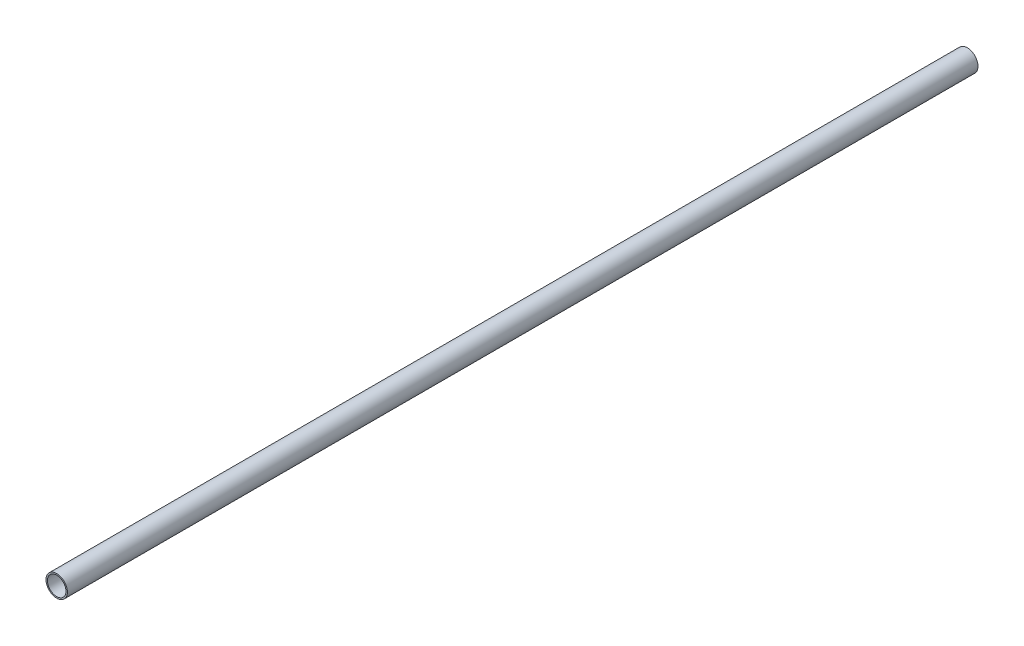
ISO-10303-21;
HEADER;
FILE_DESCRIPTION(('STEP AP214'),'2;1');
FILE_NAME('part.step','',(''),(''),'','','');
FILE_SCHEMA(('AUTOMOTIVE_DESIGN { 1 0 10303 214 1 1 1 1 }'));
ENDSEC;
DATA;
#1=APPLICATION_CONTEXT('core data for automotive mechanical design processes');
#2=APPLICATION_PROTOCOL_DEFINITION('international standard','automotive_design',2000,#1);
#3=PRODUCT_CONTEXT('',#1,'mechanical');
#4=PRODUCT('Part','Part','',(#3));
#5=PRODUCT_RELATED_PRODUCT_CATEGORY('part','',(#4));
#6=PRODUCT_DEFINITION_FORMATION('','',#4);
#7=PRODUCT_DEFINITION_CONTEXT('part definition',#1,'design');
#8=PRODUCT_DEFINITION('design','',#6,#7);
#9=PRODUCT_DEFINITION_SHAPE('','',#8);
#10=(LENGTH_UNIT() NAMED_UNIT(*) SI_UNIT(.MILLI.,.METRE.));
#11=(NAMED_UNIT(*) PLANE_ANGLE_UNIT() SI_UNIT($,.RADIAN.));
#12=(NAMED_UNIT(*) SI_UNIT($,.STERADIAN.) SOLID_ANGLE_UNIT());
#13=UNCERTAINTY_MEASURE_WITH_UNIT(LENGTH_MEASURE(1.E-05),#10,'distance_accuracy_value','');
#14=(GEOMETRIC_REPRESENTATION_CONTEXT(3) GLOBAL_UNCERTAINTY_ASSIGNED_CONTEXT((#13)) GLOBAL_UNIT_ASSIGNED_CONTEXT((#10,
#11,#12)) REPRESENTATION_CONTEXT('',''));
#15=CARTESIAN_POINT('',(0.,0.,0.));
#16=DIRECTION('',(0.,0.,1.));
#17=DIRECTION('',(1.,0.,0.));
#18=AXIS2_PLACEMENT_3D('',#15,#16,#17);
#19=CARTESIAN_POINT('',(0.,0.,-1016.));
#20=DIRECTION('',(0.,0.,1.));
#21=DIRECTION('',(1.,0.,0.));
#22=AXIS2_PLACEMENT_3D('',#19,#20,#21);
#23=CYLINDRICAL_SURFACE('',#22,11.938);
#24=CARTESIAN_POINT('',(0.,0.,-1016.));
#25=DIRECTION('',(0.,0.,1.));
#26=DIRECTION('',(1.,0.,0.));
#27=AXIS2_PLACEMENT_3D('',#24,#25,#26);
#28=CIRCLE('',#27,11.938);
#29=CARTESIAN_POINT('',(11.938,0.,-1016.));
#30=VERTEX_POINT('',#29);
#31=EDGE_CURVE('E10',#30,#30,#28,.T.);
#32=ORIENTED_EDGE('',*,*,#31,.T.);
#33=EDGE_LOOP('',(#32));
#34=FACE_BOUND('',#33,.T.);
#35=CARTESIAN_POINT('',(0.,0.,0.));
#36=DIRECTION('',(0.,0.,1.));
#37=DIRECTION('',(1.,0.,0.));
#38=AXIS2_PLACEMENT_3D('',#35,#36,#37);
#39=CIRCLE('',#38,11.938);
#40=CARTESIAN_POINT('',(11.938,0.,0.));
#41=VERTEX_POINT('',#40);
#42=EDGE_CURVE('E34',#41,#41,#39,.T.);
#43=ORIENTED_EDGE('',*,*,#42,.F.);
#44=EDGE_LOOP('',(#43));
#45=FACE_BOUND('',#44,.T.);
#46=ADVANCED_FACE('F31',(#34,#45),#23,.T.);
#47=CARTESIAN_POINT('',(0.,0.,-1016.));
#48=DIRECTION('',(0.,0.,1.));
#49=DIRECTION('',(1.,0.,0.));
#50=AXIS2_PLACEMENT_3D('',#47,#48,#49);
#51=PLANE('',#50);
#52=CARTESIAN_POINT('',(0.,0.,-1016.));
#53=DIRECTION('',(0.,0.,1.));
#54=DIRECTION('',(1.,0.,0.));
#55=AXIS2_PLACEMENT_3D('',#52,#53,#54);
#56=CIRCLE('',#55,10.3505);
#57=CARTESIAN_POINT('',(10.3505,0.,-1016.));
#58=VERTEX_POINT('',#57);
#59=EDGE_CURVE('E41',#58,#58,#56,.T.);
#60=ORIENTED_EDGE('',*,*,#59,.T.);
#61=EDGE_LOOP('',(#60));
#62=FACE_BOUND('',#61,.T.);
#63=ORIENTED_EDGE('',*,*,#31,.F.);
#64=EDGE_LOOP('',(#63));
#65=FACE_BOUND('',#64,.T.);
#66=ADVANCED_FACE('F49',(#62,#65),#51,.F.);
#67=CARTESIAN_POINT('',(0.,0.,0.));
#68=DIRECTION('',(0.,0.,1.));
#69=DIRECTION('',(1.,0.,0.));
#70=AXIS2_PLACEMENT_3D('',#67,#68,#69);
#71=PLANE('',#70);
#72=CARTESIAN_POINT('',(0.,0.,0.));
#73=DIRECTION('',(0.,0.,1.));
#74=DIRECTION('',(1.,0.,0.));
#75=AXIS2_PLACEMENT_3D('',#72,#73,#74);
#76=CIRCLE('',#75,10.3505);
#77=CARTESIAN_POINT('',(10.3505,0.,0.));
#78=VERTEX_POINT('',#77);
#79=EDGE_CURVE('E43',#78,#78,#76,.T.);
#80=ORIENTED_EDGE('',*,*,#79,.F.);
#81=EDGE_LOOP('',(#80));
#82=FACE_BOUND('',#81,.T.);
#83=ORIENTED_EDGE('',*,*,#42,.T.);
#84=EDGE_LOOP('',(#83));
#85=FACE_BOUND('',#84,.T.);
#86=ADVANCED_FACE('F55',(#82,#85),#71,.T.);
#87=CARTESIAN_POINT('',(0.,0.,-1016.));
#88=DIRECTION('',(0.,0.,1.));
#89=DIRECTION('',(1.,0.,0.));
#90=AXIS2_PLACEMENT_3D('',#87,#88,#89);
#91=CYLINDRICAL_SURFACE('',#90,10.3505);
#92=ORIENTED_EDGE('',*,*,#59,.F.);
#93=EDGE_LOOP('',(#92));
#94=FACE_BOUND('',#93,.T.);
#95=ORIENTED_EDGE('',*,*,#79,.T.);
#96=EDGE_LOOP('',(#95));
#97=FACE_BOUND('',#96,.T.);
#98=ADVANCED_FACE('F52',(#94,#97),#91,.F.);
#99=CLOSED_SHELL('',(#46,#66,#86,#98));
#100=MANIFOLD_SOLID_BREP('B2',#99);
#101=ADVANCED_BREP_SHAPE_REPRESENTATION('',(#18,#100),#14);
#102=SHAPE_DEFINITION_REPRESENTATION(#9,#101);
ENDSEC;
END-ISO-10303-21;
